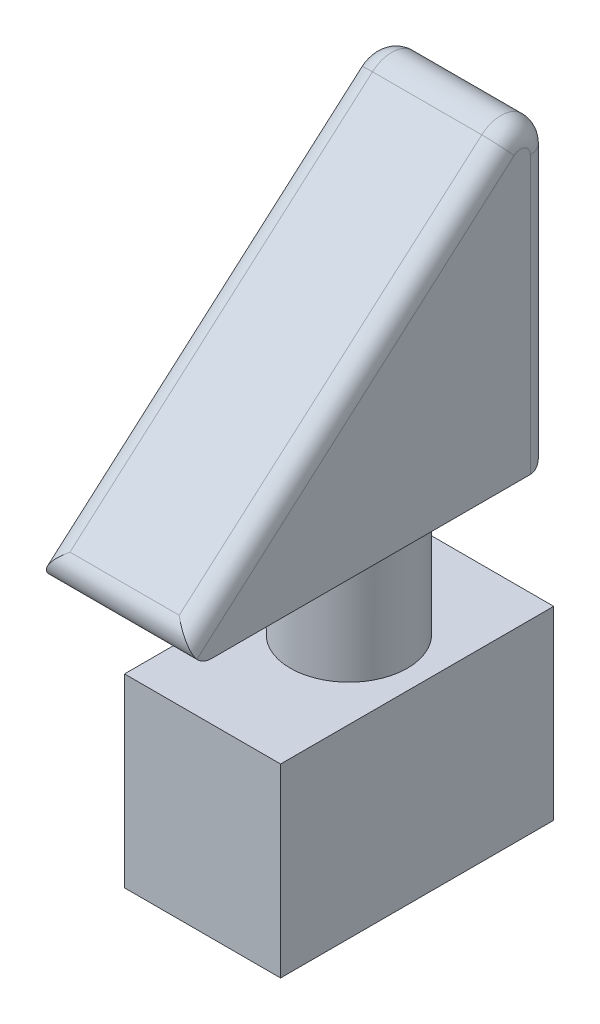
ISO-10303-21;
HEADER;
FILE_DESCRIPTION(('STEP AP214'),'2;1');
FILE_NAME('part.step','',(''),(''),'','','');
FILE_SCHEMA(('AUTOMOTIVE_DESIGN { 1 0 10303 214 1 1 1 1 }'));
ENDSEC;
DATA;
#1=APPLICATION_CONTEXT('core data for automotive mechanical design processes');
#2=APPLICATION_PROTOCOL_DEFINITION('international standard','automotive_design',2000,#1);
#3=PRODUCT_CONTEXT('',#1,'mechanical');
#4=PRODUCT('Part','Part','',(#3));
#5=PRODUCT_RELATED_PRODUCT_CATEGORY('part','',(#4));
#6=PRODUCT_DEFINITION_FORMATION('','',#4);
#7=PRODUCT_DEFINITION_CONTEXT('part definition',#1,'design');
#8=PRODUCT_DEFINITION('design','',#6,#7);
#9=PRODUCT_DEFINITION_SHAPE('','',#8);
#10=(LENGTH_UNIT() NAMED_UNIT(*) SI_UNIT(.MILLI.,.METRE.));
#11=(NAMED_UNIT(*) PLANE_ANGLE_UNIT() SI_UNIT($,.RADIAN.));
#12=(NAMED_UNIT(*) SI_UNIT($,.STERADIAN.) SOLID_ANGLE_UNIT());
#13=UNCERTAINTY_MEASURE_WITH_UNIT(LENGTH_MEASURE(1.E-05),#10,'distance_accuracy_value','');
#14=(GEOMETRIC_REPRESENTATION_CONTEXT(3) GLOBAL_UNCERTAINTY_ASSIGNED_CONTEXT((#13)) GLOBAL_UNIT_ASSIGNED_CONTEXT((#10,
#11,#12)) REPRESENTATION_CONTEXT('',''));
#15=CARTESIAN_POINT('',(0.,0.,0.));
#16=DIRECTION('',(0.,0.,1.));
#17=DIRECTION('',(1.,0.,0.));
#18=AXIS2_PLACEMENT_3D('',#15,#16,#17);
#19=CARTESIAN_POINT('',(15.2,35.,0.));
#20=DIRECTION('',(0.,0.,1.));
#21=DIRECTION('',(0.,-1.,0.));
#22=AXIS2_PLACEMENT_3D('',#19,#20,#21);
#23=PLANE('',#22);
#24=DIRECTION('',(-1.,0.,0.));
#25=VECTOR('',#24,1.);
#26=CARTESIAN_POINT('',(15.2,28.3886953202245,0.));
#27=LINE('',#26,#25);
#28=CARTESIAN_POINT('',(2.,28.3886953202245,0.));
#29=VERTEX_POINT('',#28);
#30=CARTESIAN_POINT('',(13.2,28.3886953202245,0.));
#31=VERTEX_POINT('',#30);
#32=EDGE_CURVE('E175',#29,#31,#27,.F.);
#33=ORIENTED_EDGE('',*,*,#32,.T.);
#34=DIRECTION('',(0.,1.,0.));
#35=VECTOR('',#34,1.);
#36=CARTESIAN_POINT('',(13.2,35.,0.));
#37=LINE('',#36,#35);
#38=CARTESIAN_POINT('',(13.2,2.00000000000001,0.));
#39=VERTEX_POINT('',#38);
#40=EDGE_CURVE('E204',#31,#39,#37,.F.);
#41=ORIENTED_EDGE('',*,*,#40,.T.);
#42=DIRECTION('',(-1.,0.,0.));
#43=VECTOR('',#42,1.);
#44=CARTESIAN_POINT('',(15.2,2.00000000000001,0.));
#45=LINE('',#44,#43);
#46=CARTESIAN_POINT('',(2.,2.00000000000001,0.));
#47=VERTEX_POINT('',#46);
#48=EDGE_CURVE('E202',#39,#47,#45,.T.);
#49=ORIENTED_EDGE('',*,*,#48,.T.);
#50=DIRECTION('',(0.,1.,0.));
#51=VECTOR('',#50,1.);
#52=CARTESIAN_POINT('',(2.,28.3886953202245,0.));
#53=LINE('',#52,#51);
#54=EDGE_CURVE('E200',#47,#29,#53,.T.);
#55=ORIENTED_EDGE('',*,*,#54,.T.);
#56=EDGE_LOOP('',(#33,#41,#49,#55));
#57=FACE_BOUND('',#56,.T.);
#58=ADVANCED_FACE('F36',(#57),#23,.F.);
#59=CARTESIAN_POINT('',(15.2,0.,40.));
#60=DIRECTION('',(0.,-0.752576694706878,-0.658504607868518));
#61=DIRECTION('',(0.,0.658504607868518,-0.752576694706878));
#62=AXIS2_PLACEMENT_3D('',#59,#60,#61);
#63=PLANE('',#62);
#64=DIRECTION('',(-1.,0.,0.));
#65=VECTOR('',#64,1.);
#66=CARTESIAN_POINT('',(15.2,3.50515338941375,35.9941104120986));
#67=LINE('',#66,#65);
#68=CARTESIAN_POINT('',(2.,3.50515338941375,35.9941104120986));
#69=VERTEX_POINT('',#68);
#70=CARTESIAN_POINT('',(13.2,3.50515338941375,35.9941104120986));
#71=VERTEX_POINT('',#70);
#72=EDGE_CURVE('E45',#69,#71,#67,.F.);
#73=ORIENTED_EDGE('',*,*,#72,.T.);
#74=DIRECTION('',(0.,-0.658504607868518,0.752576694706878));
#75=VECTOR('',#74,1.);
#76=CARTESIAN_POINT('',(13.2,0.,40.));
#77=LINE('',#76,#75);
#78=CARTESIAN_POINT('',(13.2,30.6464254043451,4.97551382360557));
#79=VERTEX_POINT('',#78);
#80=EDGE_CURVE('E11',#71,#79,#77,.F.);
#81=ORIENTED_EDGE('',*,*,#80,.T.);
#82=DIRECTION('',(-1.,0.,0.));
#83=VECTOR('',#82,1.);
#84=CARTESIAN_POINT('',(15.2,30.6464254043451,4.97551382360557));
#85=LINE('',#84,#83);
#86=CARTESIAN_POINT('',(2.,30.6464254043451,4.97551382360557));
#87=VERTEX_POINT('',#86);
#88=EDGE_CURVE('E173',#79,#87,#85,.T.);
#89=ORIENTED_EDGE('',*,*,#88,.T.);
#90=DIRECTION('',(0.,-0.658504607868518,0.752576694706878));
#91=VECTOR('',#90,1.);
#92=CARTESIAN_POINT('',(2.,0.,40.));
#93=LINE('',#92,#91);
#94=EDGE_CURVE('E56',#87,#69,#93,.T.);
#95=ORIENTED_EDGE('',*,*,#94,.T.);
#96=EDGE_LOOP('',(#73,#81,#89,#95));
#97=FACE_BOUND('',#96,.T.);
#98=ADVANCED_FACE('F266',(#97),#63,.F.);
#99=CARTESIAN_POINT('',(15.2,0.,0.));
#100=DIRECTION('',(0.,1.,0.));
#101=DIRECTION('',(0.,0.,1.));
#102=AXIS2_PLACEMENT_3D('',#99,#100,#101);
#103=PLANE('',#102);
#104=CARTESIAN_POINT('',(7.6,0.,13.));
#105=DIRECTION('',(0.,1.,0.));
#106=DIRECTION('',(0.,0.,1.));
#107=AXIS2_PLACEMENT_3D('',#104,#105,#106);
#108=CIRCLE('',#107,6.);
#109=CARTESIAN_POINT('',(7.6,0.,19.));
#110=VERTEX_POINT('',#109);
#111=EDGE_CURVE('E168',#110,#110,#108,.F.);
#112=ORIENTED_EDGE('',*,*,#111,.F.);
#113=EDGE_LOOP('',(#112));
#114=FACE_BOUND('',#113,.T.);
#115=DIRECTION('',(0.,0.,-1.));
#116=VECTOR('',#115,1.);
#117=CARTESIAN_POINT('',(0.,0.,0.));
#118=LINE('',#117,#116);
#119=CARTESIAN_POINT('',(0.,0.,34.6771011963615));
#120=VERTEX_POINT('',#119);
#121=CARTESIAN_POINT('',(0.,0.,2.));
#122=VERTEX_POINT('',#121);
#123=EDGE_CURVE('E159',#120,#122,#118,.T.);
#124=ORIENTED_EDGE('',*,*,#123,.T.);
#125=DIRECTION('',(-1.,0.,0.));
#126=VECTOR('',#125,1.);
#127=CARTESIAN_POINT('',(15.2,0.,2.));
#128=LINE('',#127,#126);
#129=CARTESIAN_POINT('',(15.2,0.,2.));
#130=VERTEX_POINT('',#129);
#131=EDGE_CURVE('E208',#122,#130,#128,.F.);
#132=ORIENTED_EDGE('',*,*,#131,.T.);
#133=DIRECTION('',(0.,0.,-1.));
#134=VECTOR('',#133,1.);
#135=CARTESIAN_POINT('',(15.2,0.,0.));
#136=LINE('',#135,#134);
#137=CARTESIAN_POINT('',(15.2,0.,34.6771011963615));
#138=VERTEX_POINT('',#137);
#139=EDGE_CURVE('E165',#138,#130,#136,.T.);
#140=ORIENTED_EDGE('',*,*,#139,.F.);
#141=DIRECTION('',(-1.,0.,0.));
#142=VECTOR('',#141,1.);
#143=CARTESIAN_POINT('',(15.2,0.,34.6771011963615));
#144=LINE('',#143,#142);
#145=EDGE_CURVE('E206',#138,#120,#144,.T.);
#146=ORIENTED_EDGE('',*,*,#145,.T.);
#147=EDGE_LOOP('',(#124,#132,#140,#146));
#148=FACE_BOUND('',#147,.T.);
#149=ADVANCED_FACE('F272',(#114,#148),#103,.F.);
#150=CARTESIAN_POINT('',(15.2,0.,0.));
#151=DIRECTION('',(-1.,0.,0.));
#152=DIRECTION('',(0.,0.,1.));
#153=AXIS2_PLACEMENT_3D('',#150,#151,#152);
#154=PLANE('',#153);
#155=ORIENTED_EDGE('',*,*,#139,.T.);
#156=DIRECTION('',(0.,1.,0.));
#157=VECTOR('',#156,1.);
#158=CARTESIAN_POINT('',(15.2,0.,2.));
#159=LINE('',#158,#157);
#160=CARTESIAN_POINT('',(15.2,28.3886953202245,2.00000000000001));
#161=VERTEX_POINT('',#160);
#162=EDGE_CURVE('E185',#130,#161,#159,.T.);
#163=ORIENTED_EDGE('',*,*,#162,.T.);
#164=CARTESIAN_POINT('',(15.2,28.3886953202245,3.00000000000001));
#165=DIRECTION('',(-1.,0.,0.));
#166=DIRECTION('',(0.,0.,1.));
#167=AXIS2_PLACEMENT_3D('',#164,#165,#166);
#168=CIRCLE('',#167,1.);
#169=CARTESIAN_POINT('',(15.2,29.1412720149314,3.65850460786853));
#170=VERTEX_POINT('',#169);
#171=EDGE_CURVE('E182',#161,#170,#168,.F.);
#172=ORIENTED_EDGE('',*,*,#171,.T.);
#173=DIRECTION('',(0.,-0.658504607868518,0.752576694706878));
#174=VECTOR('',#173,1.);
#175=CARTESIAN_POINT('',(15.2,18.3178554601438,16.0281235276258));
#176=LINE('',#175,#174);
#177=CARTESIAN_POINT('',(15.2,0.682990784262961,36.1822545857753));
#178=VERTEX_POINT('',#177);
#179=EDGE_CURVE('E178',#170,#178,#176,.T.);
#180=ORIENTED_EDGE('',*,*,#179,.T.);
#181=CARTESIAN_POINT('',(15.2,2.,34.6771011963615));
#182=DIRECTION('',(-1.,0.,0.));
#183=DIRECTION('',(0.,0.,1.));
#184=AXIS2_PLACEMENT_3D('',#181,#182,#183);
#185=CIRCLE('',#184,2.);
#186=EDGE_CURVE('E180',#178,#138,#185,.F.);
#187=ORIENTED_EDGE('',*,*,#186,.T.);
#188=EDGE_LOOP('',(#155,#163,#172,#180,#187));
#189=FACE_BOUND('',#188,.T.);
#190=ADVANCED_FACE('F335',(#189),#154,.F.);
#191=CARTESIAN_POINT('',(0.,0.,0.));
#192=DIRECTION('',(-1.,0.,0.));
#193=DIRECTION('',(0.,0.,1.));
#194=AXIS2_PLACEMENT_3D('',#191,#192,#193);
#195=PLANE('',#194);
#196=CARTESIAN_POINT('',(0.,28.3886953202245,3.00000000000001));
#197=DIRECTION('',(-1.,0.,0.));
#198=DIRECTION('',(0.,0.,1.));
#199=AXIS2_PLACEMENT_3D('',#196,#197,#198);
#200=CIRCLE('',#199,1.);
#201=CARTESIAN_POINT('',(0.,29.1412720149314,3.65850460786853));
#202=VERTEX_POINT('',#201);
#203=CARTESIAN_POINT('',(0.,28.3886953202245,2.00000000000001));
#204=VERTEX_POINT('',#203);
#205=EDGE_CURVE('E196',#202,#204,#200,.T.);
#206=ORIENTED_EDGE('',*,*,#205,.T.);
#207=DIRECTION('',(0.,1.,0.));
#208=VECTOR('',#207,1.);
#209=CARTESIAN_POINT('',(0.,0.,2.));
#210=LINE('',#209,#208);
#211=EDGE_CURVE('E198',#204,#122,#210,.F.);
#212=ORIENTED_EDGE('',*,*,#211,.T.);
#213=ORIENTED_EDGE('',*,*,#123,.F.);
#214=CARTESIAN_POINT('',(0.,2.,34.6771011963615));
#215=DIRECTION('',(-1.,0.,0.));
#216=DIRECTION('',(0.,0.,1.));
#217=AXIS2_PLACEMENT_3D('',#214,#215,#216);
#218=CIRCLE('',#217,2.);
#219=CARTESIAN_POINT('',(0.,0.682990784262965,36.1822545857753));
#220=VERTEX_POINT('',#219);
#221=EDGE_CURVE('E194',#120,#220,#218,.T.);
#222=ORIENTED_EDGE('',*,*,#221,.T.);
#223=DIRECTION('',(0.,-0.658504607868518,0.752576694706878));
#224=VECTOR('',#223,1.);
#225=CARTESIAN_POINT('',(0.,29.1412720149314,3.65850460786853));
#226=LINE('',#225,#224);
#227=EDGE_CURVE('E192',#220,#202,#226,.F.);
#228=ORIENTED_EDGE('',*,*,#227,.T.);
#229=EDGE_LOOP('',(#206,#212,#213,#222,#228));
#230=FACE_BOUND('',#229,.T.);
#231=ADVANCED_FACE('F331',(#230),#195,.T.);
#232=CARTESIAN_POINT('',(7.6,-12.5,13.));
#233=DIRECTION('',(0.,1.,0.));
#234=DIRECTION('',(0.,0.,1.));
#235=AXIS2_PLACEMENT_3D('',#232,#233,#234);
#236=CYLINDRICAL_SURFACE('',#235,6.);
#237=CARTESIAN_POINT('',(7.6,-12.5,13.));
#238=DIRECTION('',(0.,-1.,0.));
#239=DIRECTION('',(0.,0.,-1.));
#240=AXIS2_PLACEMENT_3D('',#237,#238,#239);
#241=CIRCLE('',#240,6.);
#242=CARTESIAN_POINT('',(7.6,-12.5,7.));
#243=VERTEX_POINT('',#242);
#244=EDGE_CURVE('E156',#243,#243,#241,.T.);
#245=ORIENTED_EDGE('',*,*,#244,.F.);
#246=EDGE_LOOP('',(#245));
#247=FACE_BOUND('',#246,.T.);
#248=ORIENTED_EDGE('',*,*,#111,.T.);
#249=EDGE_LOOP('',(#248));
#250=FACE_BOUND('',#249,.T.);
#251=ADVANCED_FACE('F342',(#247,#250),#236,.T.);
#252=CARTESIAN_POINT('',(-0.4,-31.5,0.));
#253=DIRECTION('',(1.,0.,0.));
#254=DIRECTION('',(0.,0.,-1.));
#255=AXIS2_PLACEMENT_3D('',#252,#253,#254);
#256=PLANE('',#255);
#257=DIRECTION('',(0.,0.,-1.));
#258=VECTOR('',#257,1.);
#259=CARTESIAN_POINT('',(-0.4,-12.5,0.));
#260=LINE('',#259,#258);
#261=CARTESIAN_POINT('',(-0.400000000000001,-12.5,28.));
#262=VERTEX_POINT('',#261);
#263=CARTESIAN_POINT('',(-0.4,-12.5,0.));
#264=VERTEX_POINT('',#263);
#265=EDGE_CURVE('E155',#262,#264,#260,.T.);
#266=ORIENTED_EDGE('',*,*,#265,.T.);
#267=DIRECTION('',(0.,1.,0.));
#268=VECTOR('',#267,1.);
#269=CARTESIAN_POINT('',(-0.4,-31.5,0.));
#270=LINE('',#269,#268);
#271=CARTESIAN_POINT('',(-0.4,-31.5,0.));
#272=VERTEX_POINT('',#271);
#273=EDGE_CURVE('E135',#272,#264,#270,.T.);
#274=ORIENTED_EDGE('',*,*,#273,.F.);
#275=DIRECTION('',(0.,0.,-1.));
#276=VECTOR('',#275,1.);
#277=CARTESIAN_POINT('',(-0.4,-31.5,0.));
#278=LINE('',#277,#276);
#279=CARTESIAN_POINT('',(-0.400000000000001,-31.5,28.));
#280=VERTEX_POINT('',#279);
#281=EDGE_CURVE('E142',#280,#272,#278,.T.);
#282=ORIENTED_EDGE('',*,*,#281,.F.);
#283=DIRECTION('',(0.,1.,0.));
#284=VECTOR('',#283,1.);
#285=CARTESIAN_POINT('',(-0.400000000000001,-31.5,28.));
#286=LINE('',#285,#284);
#287=EDGE_CURVE('E246',#280,#262,#286,.T.);
#288=ORIENTED_EDGE('',*,*,#287,.T.);
#289=EDGE_LOOP('',(#266,#274,#282,#288));
#290=FACE_BOUND('',#289,.T.);
#291=ADVANCED_FACE('F153',(#290),#256,.F.);
#292=CARTESIAN_POINT('',(-0.4,-31.5,0.));
#293=DIRECTION('',(0.,0.,1.));
#294=DIRECTION('',(1.,0.,0.));
#295=AXIS2_PLACEMENT_3D('',#292,#293,#294);
#296=PLANE('',#295);
#297=DIRECTION('',(1.,0.,0.));
#298=VECTOR('',#297,1.);
#299=CARTESIAN_POINT('',(-0.4,-12.5,0.));
#300=LINE('',#299,#298);
#301=CARTESIAN_POINT('',(15.6,-12.5,0.));
#302=VERTEX_POINT('',#301);
#303=EDGE_CURVE('E237',#264,#302,#300,.T.);
#304=ORIENTED_EDGE('',*,*,#303,.T.);
#305=DIRECTION('',(0.,1.,0.));
#306=VECTOR('',#305,1.);
#307=CARTESIAN_POINT('',(15.6,-31.5,0.));
#308=LINE('',#307,#306);
#309=CARTESIAN_POINT('',(15.6,-31.5,0.));
#310=VERTEX_POINT('',#309);
#311=EDGE_CURVE('E138',#310,#302,#308,.T.);
#312=ORIENTED_EDGE('',*,*,#311,.F.);
#313=DIRECTION('',(1.,0.,0.));
#314=VECTOR('',#313,1.);
#315=CARTESIAN_POINT('',(-0.4,-31.5,0.));
#316=LINE('',#315,#314);
#317=EDGE_CURVE('E131',#272,#310,#316,.T.);
#318=ORIENTED_EDGE('',*,*,#317,.F.);
#319=ORIENTED_EDGE('',*,*,#273,.T.);
#320=EDGE_LOOP('',(#304,#312,#318,#319));
#321=FACE_BOUND('',#320,.T.);
#322=ADVANCED_FACE('F133',(#321),#296,.F.);
#323=CARTESIAN_POINT('',(15.6,-31.5,0.));
#324=DIRECTION('',(-1.,0.,0.));
#325=DIRECTION('',(0.,0.,1.));
#326=AXIS2_PLACEMENT_3D('',#323,#324,#325);
#327=PLANE('',#326);
#328=DIRECTION('',(0.,0.,1.));
#329=VECTOR('',#328,1.);
#330=CARTESIAN_POINT('',(15.6,-12.5,0.));
#331=LINE('',#330,#329);
#332=CARTESIAN_POINT('',(15.6,-12.5,28.));
#333=VERTEX_POINT('',#332);
#334=EDGE_CURVE('E239',#302,#333,#331,.T.);
#335=ORIENTED_EDGE('',*,*,#334,.T.);
#336=DIRECTION('',(0.,1.,0.));
#337=VECTOR('',#336,1.);
#338=CARTESIAN_POINT('',(15.6,-31.5,28.));
#339=LINE('',#338,#337);
#340=CARTESIAN_POINT('',(15.6,-31.5,28.));
#341=VERTEX_POINT('',#340);
#342=EDGE_CURVE('E161',#341,#333,#339,.T.);
#343=ORIENTED_EDGE('',*,*,#342,.F.);
#344=DIRECTION('',(0.,0.,1.));
#345=VECTOR('',#344,1.);
#346=CARTESIAN_POINT('',(15.6,-31.5,0.));
#347=LINE('',#346,#345);
#348=EDGE_CURVE('E141',#310,#341,#347,.T.);
#349=ORIENTED_EDGE('',*,*,#348,.F.);
#350=ORIENTED_EDGE('',*,*,#311,.T.);
#351=EDGE_LOOP('',(#335,#343,#349,#350));
#352=FACE_BOUND('',#351,.T.);
#353=ADVANCED_FACE('F256',(#352),#327,.F.);
#354=CARTESIAN_POINT('',(-0.400000000000001,-31.5,28.));
#355=DIRECTION('',(0.,0.,-1.));
#356=DIRECTION('',(-1.,0.,0.));
#357=AXIS2_PLACEMENT_3D('',#354,#355,#356);
#358=PLANE('',#357);
#359=DIRECTION('',(-1.,0.,0.));
#360=VECTOR('',#359,1.);
#361=CARTESIAN_POINT('',(-0.400000000000001,-12.5,28.));
#362=LINE('',#361,#360);
#363=EDGE_CURVE('E151',#333,#262,#362,.T.);
#364=ORIENTED_EDGE('',*,*,#363,.T.);
#365=ORIENTED_EDGE('',*,*,#287,.F.);
#366=DIRECTION('',(-1.,0.,0.));
#367=VECTOR('',#366,1.);
#368=CARTESIAN_POINT('',(-0.400000000000001,-31.5,28.));
#369=LINE('',#368,#367);
#370=EDGE_CURVE('E147',#341,#280,#369,.T.);
#371=ORIENTED_EDGE('',*,*,#370,.F.);
#372=ORIENTED_EDGE('',*,*,#342,.T.);
#373=EDGE_LOOP('',(#364,#365,#371,#372));
#374=FACE_BOUND('',#373,.T.);
#375=ADVANCED_FACE('F251',(#374),#358,.F.);
#376=CARTESIAN_POINT('',(0.,-31.5,0.));
#377=DIRECTION('',(0.,1.,0.));
#378=DIRECTION('',(0.,0.,1.));
#379=AXIS2_PLACEMENT_3D('',#376,#377,#378);
#380=PLANE('',#379);
#381=ORIENTED_EDGE('',*,*,#281,.T.);
#382=ORIENTED_EDGE('',*,*,#317,.T.);
#383=ORIENTED_EDGE('',*,*,#348,.T.);
#384=ORIENTED_EDGE('',*,*,#370,.T.);
#385=EDGE_LOOP('',(#381,#382,#383,#384));
#386=FACE_BOUND('',#385,.T.);
#387=ADVANCED_FACE('F145',(#386),#380,.F.);
#388=CARTESIAN_POINT('',(0.,-12.5,0.));
#389=DIRECTION('',(0.,1.,0.));
#390=DIRECTION('',(0.,0.,1.));
#391=AXIS2_PLACEMENT_3D('',#388,#389,#390);
#392=PLANE('',#391);
#393=ORIENTED_EDGE('',*,*,#244,.T.);
#394=EDGE_LOOP('',(#393));
#395=FACE_BOUND('',#394,.T.);
#396=ORIENTED_EDGE('',*,*,#265,.F.);
#397=ORIENTED_EDGE('',*,*,#363,.F.);
#398=ORIENTED_EDGE('',*,*,#334,.F.);
#399=ORIENTED_EDGE('',*,*,#303,.F.);
#400=EDGE_LOOP('',(#396,#397,#398,#399));
#401=FACE_BOUND('',#400,.T.);
#402=ADVANCED_FACE('F255',(#395,#401),#392,.T.);
#403=CARTESIAN_POINT('',(15.2,28.3886953202245,3.00000000000001));
#404=DIRECTION('',(-1.,0.,0.));
#405=DIRECTION('',(0.,0.,1.));
#406=AXIS2_PLACEMENT_3D('',#403,#404,#405);
#407=CYLINDRICAL_SURFACE('',#406,3.);
#408=ORIENTED_EDGE('',*,*,#88,.F.);
#409=CARTESIAN_POINT('',(13.2,28.3886953202245,3.00000000000001));
#410=DIRECTION('',(-1.,0.,0.));
#411=DIRECTION('',(0.,0.,1.));
#412=AXIS2_PLACEMENT_3D('',#409,#410,#411);
#413=CIRCLE('',#412,3.);
#414=EDGE_CURVE('E189',#79,#31,#413,.T.);
#415=ORIENTED_EDGE('',*,*,#414,.T.);
#416=ORIENTED_EDGE('',*,*,#32,.F.);
#417=CARTESIAN_POINT('',(2.,28.3886953202245,3.00000000000001));
#418=DIRECTION('',(-1.,0.,0.));
#419=DIRECTION('',(0.,0.,1.));
#420=AXIS2_PLACEMENT_3D('',#417,#418,#419);
#421=CIRCLE('',#420,3.);
#422=EDGE_CURVE('E187',#29,#87,#421,.F.);
#423=ORIENTED_EDGE('',*,*,#422,.T.);
#424=EDGE_LOOP('',(#408,#415,#416,#423));
#425=FACE_BOUND('',#424,.T.);
#426=ADVANCED_FACE('F276',(#425),#407,.T.);
#427=CARTESIAN_POINT('',(2.,28.3886953202245,3.00000000000001));
#428=DIRECTION('',(-1.,0.,0.));
#429=DIRECTION('',(0.,0.,1.));
#430=AXIS2_PLACEMENT_3D('',#427,#428,#429);
#431=DEGENERATE_TOROIDAL_SURFACE('',#430,1.,2.,.T.);
#432=CARTESIAN_POINT('',(2.,29.1412720149314,3.65850460786853));
#433=DIRECTION('',(0.,-0.65850460786852,0.752576694706877));
#434=DIRECTION('',(0.,-0.752576694706877,-0.65850460786852));
#435=AXIS2_PLACEMENT_3D('',#432,#433,#434);
#436=CIRCLE('',#435,2.);
#437=EDGE_CURVE('E227',#87,#202,#436,.T.);
#438=ORIENTED_EDGE('',*,*,#437,.F.);
#439=ORIENTED_EDGE('',*,*,#422,.F.);
#440=CARTESIAN_POINT('',(2.,28.3886953202245,2.00000000000001));
#441=DIRECTION('',(0.,-1.,0.));
#442=DIRECTION('',(0.,0.,-1.));
#443=AXIS2_PLACEMENT_3D('',#440,#441,#442);
#444=CIRCLE('',#443,2.);
#445=EDGE_CURVE('E40',#204,#29,#444,.T.);
#446=ORIENTED_EDGE('',*,*,#445,.F.);
#447=ORIENTED_EDGE('',*,*,#205,.F.);
#448=EDGE_LOOP('',(#438,#439,#446,#447));
#449=FACE_BOUND('',#448,.T.);
#450=ADVANCED_FACE('F38',(#449),#431,.T.);
#451=CARTESIAN_POINT('',(2.,35.,2.));
#452=DIRECTION('',(0.,-1.,0.));
#453=DIRECTION('',(0.,0.,-1.));
#454=AXIS2_PLACEMENT_3D('',#451,#452,#453);
#455=CYLINDRICAL_SURFACE('',#454,2.);
#456=ORIENTED_EDGE('',*,*,#445,.T.);
#457=ORIENTED_EDGE('',*,*,#54,.F.);
#458=CARTESIAN_POINT('',(2.,2.00000000000001,2.));
#459=DIRECTION('',(0.707106781186547,-0.707106781186547,0.));
#460=DIRECTION('',(-0.707106781186547,-0.707106781186547,0.));
#461=AXIS2_PLACEMENT_3D('',#458,#459,#460);
#462=ELLIPSE('',#461,2.82842712474619,2.);
#463=EDGE_CURVE('E225',#122,#47,#462,.T.);
#464=ORIENTED_EDGE('',*,*,#463,.F.);
#465=ORIENTED_EDGE('',*,*,#211,.F.);
#466=EDGE_LOOP('',(#456,#457,#464,#465));
#467=FACE_BOUND('',#466,.T.);
#468=ADVANCED_FACE('F302',(#467),#455,.T.);
#469=CARTESIAN_POINT('',(2.,-1.50515338941376,38.682990784263));
#470=DIRECTION('',(0.,0.658504607868518,-0.752576694706878));
#471=DIRECTION('',(0.,0.752576694706878,0.658504607868518));
#472=AXIS2_PLACEMENT_3D('',#469,#470,#471);
#473=CYLINDRICAL_SURFACE('',#472,2.);
#474=ORIENTED_EDGE('',*,*,#437,.T.);
#475=ORIENTED_EDGE('',*,*,#227,.F.);
#476=CARTESIAN_POINT('',(2.,2.,34.6771011963615));
#477=DIRECTION('',(-0.707106781186547,0.465633073666417,-0.532152084190191));
#478=DIRECTION('',(0.707106781186547,0.465633073666417,-0.532152084190191));
#479=AXIS2_PLACEMENT_3D('',#476,#477,#478);
#480=ELLIPSE('',#479,2.82842712474619,2.);
#481=EDGE_CURVE('E222',#69,#220,#480,.F.);
#482=ORIENTED_EDGE('',*,*,#481,.F.);
#483=ORIENTED_EDGE('',*,*,#94,.F.);
#484=EDGE_LOOP('',(#474,#475,#482,#483));
#485=FACE_BOUND('',#484,.T.);
#486=ADVANCED_FACE('F299',(#485),#473,.T.);
#487=CARTESIAN_POINT('',(15.2,2.00000000000001,2.));
#488=DIRECTION('',(-1.,0.,0.));
#489=DIRECTION('',(0.,0.,1.));
#490=AXIS2_PLACEMENT_3D('',#487,#488,#489);
#491=CYLINDRICAL_SURFACE('',#490,2.);
#492=ORIENTED_EDGE('',*,*,#463,.T.);
#493=ORIENTED_EDGE('',*,*,#48,.F.);
#494=CARTESIAN_POINT('',(13.2,2.00000000000001,2.));
#495=DIRECTION('',(0.707106781186547,0.707106781186547,0.));
#496=DIRECTION('',(-0.707106781186547,0.707106781186547,0.));
#497=AXIS2_PLACEMENT_3D('',#494,#495,#496);
#498=ELLIPSE('',#497,2.82842712474619,2.);
#499=EDGE_CURVE('E219',#130,#39,#498,.T.);
#500=ORIENTED_EDGE('',*,*,#499,.F.);
#501=ORIENTED_EDGE('',*,*,#131,.F.);
#502=EDGE_LOOP('',(#492,#493,#500,#501));
#503=FACE_BOUND('',#502,.T.);
#504=ADVANCED_FACE('F295',(#503),#491,.T.);
#505=CARTESIAN_POINT('',(15.2,2.,34.6771011963615));
#506=DIRECTION('',(-1.,0.,0.));
#507=DIRECTION('',(0.,0.,1.));
#508=AXIS2_PLACEMENT_3D('',#505,#506,#507);
#509=CYLINDRICAL_SURFACE('',#508,2.);
#510=ORIENTED_EDGE('',*,*,#145,.F.);
#511=ORIENTED_EDGE('',*,*,#186,.F.);
#512=CARTESIAN_POINT('',(13.2,2.,34.6771011963615));
#513=DIRECTION('',(-0.707106781186547,-0.465633073666417,0.532152084190191));
#514=DIRECTION('',(0.707106781186547,-0.465633073666417,0.532152084190191));
#515=AXIS2_PLACEMENT_3D('',#512,#513,#514);
#516=ELLIPSE('',#515,2.82842712474619,2.);
#517=EDGE_CURVE('E216',#71,#178,#516,.F.);
#518=ORIENTED_EDGE('',*,*,#517,.F.);
#519=ORIENTED_EDGE('',*,*,#72,.F.);
#520=ORIENTED_EDGE('',*,*,#481,.T.);
#521=ORIENTED_EDGE('',*,*,#221,.F.);
#522=EDGE_LOOP('',(#510,#511,#518,#519,#520,#521));
#523=FACE_BOUND('',#522,.T.);
#524=ADVANCED_FACE('F291',(#523),#509,.T.);
#525=CARTESIAN_POINT('',(13.2,0.,2.));
#526=DIRECTION('',(0.,1.,0.));
#527=DIRECTION('',(0.,0.,1.));
#528=AXIS2_PLACEMENT_3D('',#525,#526,#527);
#529=CYLINDRICAL_SURFACE('',#528,2.);
#530=ORIENTED_EDGE('',*,*,#499,.T.);
#531=ORIENTED_EDGE('',*,*,#40,.F.);
#532=CARTESIAN_POINT('',(13.2,28.3886953202245,2.));
#533=DIRECTION('',(0.,1.,0.));
#534=DIRECTION('',(0.,0.,1.));
#535=AXIS2_PLACEMENT_3D('',#532,#533,#534);
#536=CIRCLE('',#535,2.);
#537=EDGE_CURVE('E214',#161,#31,#536,.T.);
#538=ORIENTED_EDGE('',*,*,#537,.F.);
#539=ORIENTED_EDGE('',*,*,#162,.F.);
#540=EDGE_LOOP('',(#530,#531,#538,#539));
#541=FACE_BOUND('',#540,.T.);
#542=ADVANCED_FACE('F287',(#541),#529,.T.);
#543=CARTESIAN_POINT('',(13.2,18.3178554601438,16.0281235276258));
#544=DIRECTION('',(0.,-0.658504607868518,0.752576694706878));
#545=DIRECTION('',(0.,-0.752576694706878,-0.658504607868518));
#546=AXIS2_PLACEMENT_3D('',#543,#544,#545);
#547=CYLINDRICAL_SURFACE('',#546,2.);
#548=ORIENTED_EDGE('',*,*,#517,.T.);
#549=ORIENTED_EDGE('',*,*,#179,.F.);
#550=CARTESIAN_POINT('',(13.2,29.1412720149314,3.65850460786853));
#551=DIRECTION('',(0.,0.658504607868518,-0.752576694706878));
#552=DIRECTION('',(0.,0.752576694706878,0.658504607868518));
#553=AXIS2_PLACEMENT_3D('',#550,#551,#552);
#554=CIRCLE('',#553,2.);
#555=EDGE_CURVE('E212',#79,#170,#554,.T.);
#556=ORIENTED_EDGE('',*,*,#555,.F.);
#557=ORIENTED_EDGE('',*,*,#80,.F.);
#558=EDGE_LOOP('',(#548,#549,#556,#557));
#559=FACE_BOUND('',#558,.T.);
#560=ADVANCED_FACE('F283',(#559),#547,.T.);
#561=CARTESIAN_POINT('',(13.2,28.3886953202245,3.00000000000001));
#562=DIRECTION('',(-1.,0.,0.));
#563=DIRECTION('',(0.,0.,1.));
#564=AXIS2_PLACEMENT_3D('',#561,#562,#563);
#565=DEGENERATE_TOROIDAL_SURFACE('',#564,1.,2.,.T.);
#566=ORIENTED_EDGE('',*,*,#537,.T.);
#567=ORIENTED_EDGE('',*,*,#414,.F.);
#568=ORIENTED_EDGE('',*,*,#555,.T.);
#569=ORIENTED_EDGE('',*,*,#171,.F.);
#570=EDGE_LOOP('',(#566,#567,#568,#569));
#571=FACE_BOUND('',#570,.T.);
#572=ADVANCED_FACE('F280',(#571),#565,.T.);
#573=CLOSED_SHELL('',(#58,#98,#149,#190,#231,#251,#291,#322,#353,#375,#387,#402,#426,#450,#468,
#486,#504,#524,#542,#560,#572));
#574=MANIFOLD_SOLID_BREP('B2',#573);
#575=ADVANCED_BREP_SHAPE_REPRESENTATION('',(#18,#574),#14);
#576=SHAPE_DEFINITION_REPRESENTATION(#9,#575);
ENDSEC;
END-ISO-10303-21;
